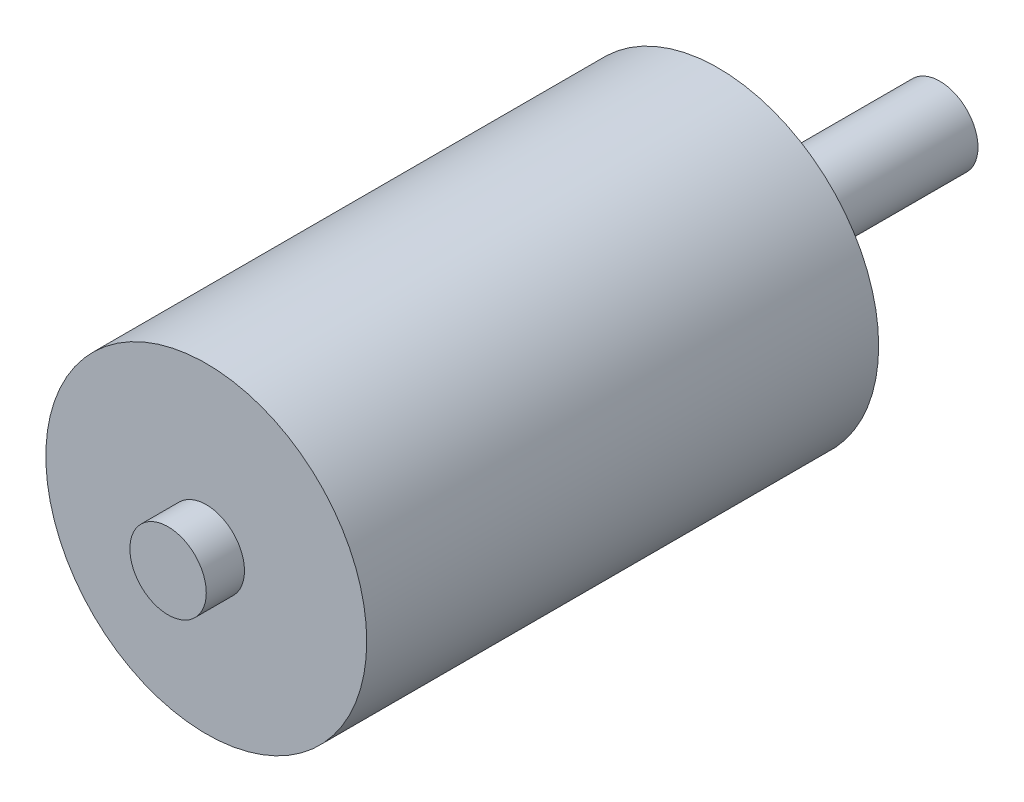
ISO-10303-21;
HEADER;
FILE_DESCRIPTION(('STEP AP214'),'2;1');
FILE_NAME('part.step','',(''),(''),'','','');
FILE_SCHEMA(('AUTOMOTIVE_DESIGN { 1 0 10303 214 1 1 1 1 }'));
ENDSEC;
DATA;
#1=APPLICATION_CONTEXT('core data for automotive mechanical design processes');
#2=APPLICATION_PROTOCOL_DEFINITION('international standard','automotive_design',2000,#1);
#3=PRODUCT_CONTEXT('',#1,'mechanical');
#4=PRODUCT('Part','Part','',(#3));
#5=PRODUCT_RELATED_PRODUCT_CATEGORY('part','',(#4));
#6=PRODUCT_DEFINITION_FORMATION('','',#4);
#7=PRODUCT_DEFINITION_CONTEXT('part definition',#1,'design');
#8=PRODUCT_DEFINITION('design','',#6,#7);
#9=PRODUCT_DEFINITION_SHAPE('','',#8);
#10=(LENGTH_UNIT() NAMED_UNIT(*) SI_UNIT(.MILLI.,.METRE.));
#11=(NAMED_UNIT(*) PLANE_ANGLE_UNIT() SI_UNIT($,.RADIAN.));
#12=(NAMED_UNIT(*) SI_UNIT($,.STERADIAN.) SOLID_ANGLE_UNIT());
#13=UNCERTAINTY_MEASURE_WITH_UNIT(LENGTH_MEASURE(1.E-05),#10,'distance_accuracy_value','');
#14=(GEOMETRIC_REPRESENTATION_CONTEXT(3) GLOBAL_UNCERTAINTY_ASSIGNED_CONTEXT((#13)) GLOBAL_UNIT_ASSIGNED_CONTEXT((#10,
#11,#12)) REPRESENTATION_CONTEXT('',''));
#15=CARTESIAN_POINT('',(0.,0.,0.));
#16=DIRECTION('',(0.,0.,1.));
#17=DIRECTION('',(1.,0.,0.));
#18=AXIS2_PLACEMENT_3D('',#15,#16,#17);
#19=CARTESIAN_POINT('',(0.,0.,67.));
#20=DIRECTION('',(0.,0.,-1.));
#21=DIRECTION('',(-1.,0.,0.));
#22=AXIS2_PLACEMENT_3D('',#19,#20,#21);
#23=CYLINDRICAL_SURFACE('',#22,21.);
#24=CARTESIAN_POINT('',(0.,0.,67.));
#25=DIRECTION('',(0.,0.,1.));
#26=DIRECTION('',(1.,0.,0.));
#27=AXIS2_PLACEMENT_3D('',#24,#25,#26);
#28=CIRCLE('',#27,21.);
#29=CARTESIAN_POINT('',(21.,0.,67.));
#30=VERTEX_POINT('',#29);
#31=EDGE_CURVE('E10',#30,#30,#28,.T.);
#32=ORIENTED_EDGE('',*,*,#31,.F.);
#33=EDGE_LOOP('',(#32));
#34=FACE_BOUND('',#33,.T.);
#35=CARTESIAN_POINT('',(0.,0.,0.));
#36=DIRECTION('',(0.,0.,1.));
#37=DIRECTION('',(1.,0.,0.));
#38=AXIS2_PLACEMENT_3D('',#35,#36,#37);
#39=CIRCLE('',#38,21.);
#40=CARTESIAN_POINT('',(21.,0.,0.));
#41=VERTEX_POINT('',#40);
#42=EDGE_CURVE('E42',#41,#41,#39,.T.);
#43=ORIENTED_EDGE('',*,*,#42,.T.);
#44=EDGE_LOOP('',(#43));
#45=FACE_BOUND('',#44,.T.);
#46=ADVANCED_FACE('F35',(#34,#45),#23,.T.);
#47=CARTESIAN_POINT('',(0.,0.,67.));
#48=DIRECTION('',(0.,0.,1.));
#49=DIRECTION('',(1.,0.,0.));
#50=AXIS2_PLACEMENT_3D('',#47,#48,#49);
#51=PLANE('',#50);
#52=CARTESIAN_POINT('',(0.,0.,67.));
#53=DIRECTION('',(0.,0.,1.));
#54=DIRECTION('',(1.,0.,0.));
#55=AXIS2_PLACEMENT_3D('',#52,#53,#54);
#56=CIRCLE('',#55,5.);
#57=CARTESIAN_POINT('',(5.,0.,67.));
#58=VERTEX_POINT('',#57);
#59=EDGE_CURVE('E58',#58,#58,#56,.T.);
#60=ORIENTED_EDGE('',*,*,#59,.F.);
#61=EDGE_LOOP('',(#60));
#62=FACE_BOUND('',#61,.T.);
#63=ORIENTED_EDGE('',*,*,#31,.T.);
#64=EDGE_LOOP('',(#63));
#65=FACE_BOUND('',#64,.T.);
#66=ADVANCED_FACE('F100',(#62,#65),#51,.T.);
#67=CARTESIAN_POINT('',(0.,0.,0.));
#68=DIRECTION('',(0.,0.,1.));
#69=DIRECTION('',(1.,0.,0.));
#70=AXIS2_PLACEMENT_3D('',#67,#68,#69);
#71=PLANE('',#70);
#72=CARTESIAN_POINT('',(17.5,0.,0.));
#73=DIRECTION('',(0.,0.,1.));
#74=DIRECTION('',(1.,0.,0.));
#75=AXIS2_PLACEMENT_3D('',#72,#73,#74);
#76=CIRCLE('',#75,2.);
#77=CARTESIAN_POINT('',(19.5,0.,0.));
#78=VERTEX_POINT('',#77);
#79=EDGE_CURVE('E82',#78,#78,#76,.T.);
#80=ORIENTED_EDGE('',*,*,#79,.T.);
#81=EDGE_LOOP('',(#80));
#82=FACE_BOUND('',#81,.T.);
#83=CARTESIAN_POINT('',(0.,17.5,0.));
#84=DIRECTION('',(0.,0.,1.));
#85=DIRECTION('',(1.,0.,0.));
#86=AXIS2_PLACEMENT_3D('',#83,#84,#85);
#87=CIRCLE('',#86,2.);
#88=CARTESIAN_POINT('',(2.,17.5,0.));
#89=VERTEX_POINT('',#88);
#90=EDGE_CURVE('E76',#89,#89,#87,.T.);
#91=ORIENTED_EDGE('',*,*,#90,.T.);
#92=EDGE_LOOP('',(#91));
#93=FACE_BOUND('',#92,.T.);
#94=CARTESIAN_POINT('',(0.,-17.5,0.));
#95=DIRECTION('',(0.,0.,1.));
#96=DIRECTION('',(1.,0.,0.));
#97=AXIS2_PLACEMENT_3D('',#94,#95,#96);
#98=CIRCLE('',#97,2.);
#99=CARTESIAN_POINT('',(2.,-17.5,0.));
#100=VERTEX_POINT('',#99);
#101=EDGE_CURVE('E70',#100,#100,#98,.T.);
#102=ORIENTED_EDGE('',*,*,#101,.T.);
#103=EDGE_LOOP('',(#102));
#104=FACE_BOUND('',#103,.T.);
#105=CARTESIAN_POINT('',(-17.5,0.,0.));
#106=DIRECTION('',(0.,0.,1.));
#107=DIRECTION('',(1.,0.,0.));
#108=AXIS2_PLACEMENT_3D('',#105,#106,#107);
#109=CIRCLE('',#108,2.);
#110=CARTESIAN_POINT('',(-15.5,0.,0.));
#111=VERTEX_POINT('',#110);
#112=EDGE_CURVE('E64',#111,#111,#109,.T.);
#113=ORIENTED_EDGE('',*,*,#112,.T.);
#114=EDGE_LOOP('',(#113));
#115=FACE_BOUND('',#114,.T.);
#116=CARTESIAN_POINT('',(0.,0.,0.));
#117=DIRECTION('',(0.,0.,1.));
#118=DIRECTION('',(1.,0.,0.));
#119=AXIS2_PLACEMENT_3D('',#116,#117,#118);
#120=CIRCLE('',#119,13.);
#121=CARTESIAN_POINT('',(13.,0.,0.));
#122=VERTEX_POINT('',#121);
#123=EDGE_CURVE('E49',#122,#122,#120,.T.);
#124=ORIENTED_EDGE('',*,*,#123,.T.);
#125=EDGE_LOOP('',(#124));
#126=FACE_BOUND('',#125,.T.);
#127=ORIENTED_EDGE('',*,*,#42,.F.);
#128=EDGE_LOOP('',(#127));
#129=FACE_BOUND('',#128,.T.);
#130=ADVANCED_FACE('F105',(#82,#93,#104,#115,#126,#129),#71,.F.);
#131=CARTESIAN_POINT('',(0.,0.,-2.));
#132=DIRECTION('',(0.,0.,1.));
#133=DIRECTION('',(1.,0.,0.));
#134=AXIS2_PLACEMENT_3D('',#131,#132,#133);
#135=CYLINDRICAL_SURFACE('',#134,13.);
#136=CARTESIAN_POINT('',(0.,0.,-2.));
#137=DIRECTION('',(0.,0.,1.));
#138=DIRECTION('',(1.,0.,0.));
#139=AXIS2_PLACEMENT_3D('',#136,#137,#138);
#140=CIRCLE('',#139,13.);
#141=CARTESIAN_POINT('',(13.,0.,-2.));
#142=VERTEX_POINT('',#141);
#143=EDGE_CURVE('E47',#142,#142,#140,.T.);
#144=ORIENTED_EDGE('',*,*,#143,.T.);
#145=EDGE_LOOP('',(#144));
#146=FACE_BOUND('',#145,.T.);
#147=ORIENTED_EDGE('',*,*,#123,.F.);
#148=EDGE_LOOP('',(#147));
#149=FACE_BOUND('',#148,.T.);
#150=ADVANCED_FACE('F112',(#146,#149),#135,.T.);
#151=CARTESIAN_POINT('',(0.,0.,-2.));
#152=DIRECTION('',(0.,0.,1.));
#153=DIRECTION('',(1.,0.,0.));
#154=AXIS2_PLACEMENT_3D('',#151,#152,#153);
#155=PLANE('',#154);
#156=CARTESIAN_POINT('',(0.,0.,-2.));
#157=DIRECTION('',(0.,0.,1.));
#158=DIRECTION('',(1.,0.,0.));
#159=AXIS2_PLACEMENT_3D('',#156,#157,#158);
#160=CIRCLE('',#159,5.);
#161=CARTESIAN_POINT('',(5.,0.,-2.));
#162=VERTEX_POINT('',#161);
#163=EDGE_CURVE('E38',#162,#162,#160,.T.);
#164=ORIENTED_EDGE('',*,*,#163,.T.);
#165=EDGE_LOOP('',(#164));
#166=FACE_BOUND('',#165,.T.);
#167=ORIENTED_EDGE('',*,*,#143,.F.);
#168=EDGE_LOOP('',(#167));
#169=FACE_BOUND('',#168,.T.);
#170=ADVANCED_FACE('F117',(#166,#169),#155,.F.);
#171=CARTESIAN_POINT('',(0.,0.,-29.));
#172=DIRECTION('',(0.,0.,1.));
#173=DIRECTION('',(1.,0.,0.));
#174=AXIS2_PLACEMENT_3D('',#171,#172,#173);
#175=CYLINDRICAL_SURFACE('',#174,5.);
#176=CARTESIAN_POINT('',(0.,0.,-29.));
#177=DIRECTION('',(0.,0.,1.));
#178=DIRECTION('',(1.,0.,0.));
#179=AXIS2_PLACEMENT_3D('',#176,#177,#178);
#180=CIRCLE('',#179,5.);
#181=CARTESIAN_POINT('',(5.,0.,-29.));
#182=VERTEX_POINT('',#181);
#183=EDGE_CURVE('E54',#182,#182,#180,.T.);
#184=CARTESIAN_POINT('',(5.,0.,-29.));
#185=CARTESIAN_POINT('',(5.,0.,-28.71875));
#186=CARTESIAN_POINT('',(5.,0.,-28.4375));
#187=CARTESIAN_POINT('',(5.,0.,-27.875));
#188=CARTESIAN_POINT('',(5.,0.,-27.59375));
#189=CARTESIAN_POINT('',(5.,0.,-27.03125));
#190=CARTESIAN_POINT('',(5.,0.,-26.75));
#191=CARTESIAN_POINT('',(5.,0.,-26.1875));
#192=CARTESIAN_POINT('',(5.,0.,-25.90625));
#193=CARTESIAN_POINT('',(5.,0.,-25.34375));
#194=CARTESIAN_POINT('',(5.,0.,-25.0625));
#195=CARTESIAN_POINT('',(5.,0.,-24.5));
#196=CARTESIAN_POINT('',(5.,0.,-24.21875));
#197=CARTESIAN_POINT('',(5.,0.,-23.65625));
#198=CARTESIAN_POINT('',(5.,0.,-23.375));
#199=CARTESIAN_POINT('',(5.,0.,-22.8125));
#200=CARTESIAN_POINT('',(5.,0.,-22.53125));
#201=CARTESIAN_POINT('',(5.,0.,-21.96875));
#202=CARTESIAN_POINT('',(5.,0.,-21.6875));
#203=CARTESIAN_POINT('',(5.,0.,-21.125));
#204=CARTESIAN_POINT('',(5.,0.,-20.84375));
#205=CARTESIAN_POINT('',(5.,0.,-20.28125));
#206=CARTESIAN_POINT('',(5.,0.,-20.));
#207=CARTESIAN_POINT('',(5.,0.,-19.4375));
#208=CARTESIAN_POINT('',(5.,0.,-19.15625));
#209=CARTESIAN_POINT('',(5.,0.,-18.59375));
#210=CARTESIAN_POINT('',(5.,0.,-18.3125));
#211=CARTESIAN_POINT('',(5.,0.,-17.75));
#212=CARTESIAN_POINT('',(5.,0.,-17.46875));
#213=CARTESIAN_POINT('',(5.,0.,-16.90625));
#214=CARTESIAN_POINT('',(5.,0.,-16.625));
#215=CARTESIAN_POINT('',(5.,0.,-16.0625));
#216=CARTESIAN_POINT('',(5.,0.,-15.78125));
#217=CARTESIAN_POINT('',(5.,0.,-15.21875));
#218=CARTESIAN_POINT('',(5.,0.,-14.9375));
#219=CARTESIAN_POINT('',(5.,0.,-14.375));
#220=CARTESIAN_POINT('',(5.,0.,-14.09375));
#221=CARTESIAN_POINT('',(5.,0.,-13.53125));
#222=CARTESIAN_POINT('',(5.,0.,-13.25));
#223=CARTESIAN_POINT('',(5.,0.,-12.6875));
#224=CARTESIAN_POINT('',(5.,0.,-12.40625));
#225=CARTESIAN_POINT('',(5.,0.,-11.84375));
#226=CARTESIAN_POINT('',(5.,0.,-11.5625));
#227=CARTESIAN_POINT('',(5.,0.,-11.));
#228=CARTESIAN_POINT('',(5.,0.,-10.71875));
#229=CARTESIAN_POINT('',(5.,0.,-10.15625));
#230=CARTESIAN_POINT('',(5.,0.,-9.875));
#231=CARTESIAN_POINT('',(5.,0.,-9.3125));
#232=CARTESIAN_POINT('',(5.,0.,-9.03125));
#233=CARTESIAN_POINT('',(5.,0.,-8.46875));
#234=CARTESIAN_POINT('',(5.,0.,-8.1875));
#235=CARTESIAN_POINT('',(5.,0.,-7.625));
#236=CARTESIAN_POINT('',(5.,0.,-7.34375));
#237=CARTESIAN_POINT('',(5.,0.,-6.78125));
#238=CARTESIAN_POINT('',(5.,0.,-6.5));
#239=CARTESIAN_POINT('',(5.,0.,-5.9375));
#240=CARTESIAN_POINT('',(5.,0.,-5.65625));
#241=CARTESIAN_POINT('',(5.,0.,-5.09375));
#242=CARTESIAN_POINT('',(5.,0.,-4.8125));
#243=CARTESIAN_POINT('',(5.,0.,-4.25));
#244=CARTESIAN_POINT('',(5.,0.,-3.96875));
#245=CARTESIAN_POINT('',(5.,0.,-3.40625));
#246=CARTESIAN_POINT('',(5.,0.,-3.125));
#247=CARTESIAN_POINT('',(5.,0.,-2.5625));
#248=CARTESIAN_POINT('',(5.,0.,-2.28125));
#249=CARTESIAN_POINT('',(5.,0.,-2.));
#250=B_SPLINE_CURVE_WITH_KNOTS('',3,(#184,#185,#186,#187,#188,#189,#190,#191,#192,#193,#194,
#195,#196,#197,#198,#199,#200,#201,#202,#203,#204,#205,#206,#207,#208,#209,#210,#211,#212,#213,
#214,#215,#216,#217,#218,#219,#220,#221,#222,#223,#224,#225,#226,#227,#228,#229,#230,#231,#232,
#233,#234,#235,#236,#237,#238,#239,#240,#241,#242,#243,#244,#245,#246,#247,#248,#249),
.UNSPECIFIED.,.F.,.F.,(4,2,2,2,2,2,2,2,2,2,2,2,2,2,2,2,2,2,2,2,2,2,2,2,2,2,2,2,2,2,2,2,4),(0.,
0.843749999999997,1.6875,2.53125,3.375,4.21875,5.0625,5.90625,6.75,7.59375,8.4375,9.28125,
10.125,10.96875,11.8125,12.65625,13.5,14.34375,15.1875,16.03125,16.875,17.71875,18.5625,
19.40625,20.25,21.09375,21.9375,22.78125,23.625,24.46875,25.3125,26.15625,27.),.UNSPECIFIED.);
#251=EDGE_CURVE('BSEAM124',#182,#162,#250,.T.);
#252=ORIENTED_EDGE('',*,*,#183,.T.);
#253=ORIENTED_EDGE('',*,*,#163,.F.);
#254=ORIENTED_EDGE('',*,*,#251,.T.);
#255=ORIENTED_EDGE('',*,*,#251,.F.);
#256=EDGE_LOOP('',(#252,#254,#253,#255));
#257=FACE_BOUND('',#256,.T.);
#258=ADVANCED_FACE('F124',(#257),#175,.T.);
#259=CARTESIAN_POINT('',(0.,0.,-29.));
#260=DIRECTION('',(0.,0.,1.));
#261=DIRECTION('',(1.,0.,0.));
#262=AXIS2_PLACEMENT_3D('',#259,#260,#261);
#263=PLANE('',#262);
#264=ORIENTED_EDGE('',*,*,#183,.F.);
#265=EDGE_LOOP('',(#264));
#266=FACE_BOUND('',#265,.T.);
#267=ADVANCED_FACE('F128',(#266),#263,.F.);
#268=CARTESIAN_POINT('',(0.,0.,72.));
#269=DIRECTION('',(0.,0.,-1.));
#270=DIRECTION('',(-1.,0.,0.));
#271=AXIS2_PLACEMENT_3D('',#268,#269,#270);
#272=CYLINDRICAL_SURFACE('',#271,5.);
#273=CARTESIAN_POINT('',(0.,0.,72.));
#274=DIRECTION('',(0.,0.,1.));
#275=DIRECTION('',(1.,0.,0.));
#276=AXIS2_PLACEMENT_3D('',#273,#274,#275);
#277=CIRCLE('',#276,5.);
#278=CARTESIAN_POINT('',(5.,0.,72.));
#279=VERTEX_POINT('',#278);
#280=EDGE_CURVE('E57',#279,#279,#277,.T.);
#281=ORIENTED_EDGE('',*,*,#280,.F.);
#282=EDGE_LOOP('',(#281));
#283=FACE_BOUND('',#282,.T.);
#284=ORIENTED_EDGE('',*,*,#59,.T.);
#285=EDGE_LOOP('',(#284));
#286=FACE_BOUND('',#285,.T.);
#287=ADVANCED_FACE('F132',(#283,#286),#272,.T.);
#288=CARTESIAN_POINT('',(0.,0.,72.));
#289=DIRECTION('',(0.,0.,1.));
#290=DIRECTION('',(1.,0.,0.));
#291=AXIS2_PLACEMENT_3D('',#288,#289,#290);
#292=PLANE('',#291);
#293=ORIENTED_EDGE('',*,*,#280,.T.);
#294=EDGE_LOOP('',(#293));
#295=FACE_BOUND('',#294,.T.);
#296=ADVANCED_FACE('F136',(#295),#292,.T.);
#297=CARTESIAN_POINT('',(-17.5,0.,7.));
#298=DIRECTION('',(0.,0.,-1.));
#299=DIRECTION('',(-1.,0.,0.));
#300=AXIS2_PLACEMENT_3D('',#297,#298,#299);
#301=CYLINDRICAL_SURFACE('',#300,2.);
#302=CARTESIAN_POINT('',(-17.5,0.,7.));
#303=DIRECTION('',(0.,0.,1.));
#304=DIRECTION('',(1.,0.,0.));
#305=AXIS2_PLACEMENT_3D('',#302,#303,#304);
#306=CIRCLE('',#305,2.);
#307=CARTESIAN_POINT('',(-15.5,0.,7.));
#308=VERTEX_POINT('',#307);
#309=EDGE_CURVE('E61',#308,#308,#306,.T.);
#310=ORIENTED_EDGE('',*,*,#309,.T.);
#311=EDGE_LOOP('',(#310));
#312=FACE_BOUND('',#311,.T.);
#313=ORIENTED_EDGE('',*,*,#112,.F.);
#314=EDGE_LOOP('',(#313));
#315=FACE_BOUND('',#314,.T.);
#316=ADVANCED_FACE('F140',(#312,#315),#301,.F.);
#317=CARTESIAN_POINT('',(-17.5,0.,7.));
#318=DIRECTION('',(0.,0.,1.));
#319=DIRECTION('',(1.,0.,0.));
#320=AXIS2_PLACEMENT_3D('',#317,#318,#319);
#321=PLANE('',#320);
#322=ORIENTED_EDGE('',*,*,#309,.F.);
#323=EDGE_LOOP('',(#322));
#324=FACE_BOUND('',#323,.T.);
#325=ADVANCED_FACE('F144',(#324),#321,.F.);
#326=CARTESIAN_POINT('',(0.,-17.5,7.));
#327=DIRECTION('',(0.,0.,-1.));
#328=DIRECTION('',(-1.,0.,0.));
#329=AXIS2_PLACEMENT_3D('',#326,#327,#328);
#330=CYLINDRICAL_SURFACE('',#329,2.);
#331=CARTESIAN_POINT('',(0.,-17.5,7.));
#332=DIRECTION('',(0.,0.,1.));
#333=DIRECTION('',(1.,0.,0.));
#334=AXIS2_PLACEMENT_3D('',#331,#332,#333);
#335=CIRCLE('',#334,2.);
#336=CARTESIAN_POINT('',(2.,-17.5,7.));
#337=VERTEX_POINT('',#336);
#338=EDGE_CURVE('E73',#337,#337,#335,.T.);
#339=ORIENTED_EDGE('',*,*,#338,.T.);
#340=EDGE_LOOP('',(#339));
#341=FACE_BOUND('',#340,.T.);
#342=ORIENTED_EDGE('',*,*,#101,.F.);
#343=EDGE_LOOP('',(#342));
#344=FACE_BOUND('',#343,.T.);
#345=ADVANCED_FACE('F148',(#341,#344),#330,.F.);
#346=CARTESIAN_POINT('',(0.,-17.5,7.));
#347=DIRECTION('',(0.,0.,1.));
#348=DIRECTION('',(1.,0.,0.));
#349=AXIS2_PLACEMENT_3D('',#346,#347,#348);
#350=PLANE('',#349);
#351=ORIENTED_EDGE('',*,*,#338,.F.);
#352=EDGE_LOOP('',(#351));
#353=FACE_BOUND('',#352,.T.);
#354=ADVANCED_FACE('F152',(#353),#350,.F.);
#355=CARTESIAN_POINT('',(0.,17.5,7.));
#356=DIRECTION('',(0.,0.,-1.));
#357=DIRECTION('',(-1.,0.,0.));
#358=AXIS2_PLACEMENT_3D('',#355,#356,#357);
#359=CYLINDRICAL_SURFACE('',#358,2.);
#360=CARTESIAN_POINT('',(0.,17.5,7.));
#361=DIRECTION('',(0.,0.,1.));
#362=DIRECTION('',(1.,0.,0.));
#363=AXIS2_PLACEMENT_3D('',#360,#361,#362);
#364=CIRCLE('',#363,2.);
#365=CARTESIAN_POINT('',(2.,17.5,7.));
#366=VERTEX_POINT('',#365);
#367=EDGE_CURVE('E79',#366,#366,#364,.T.);
#368=ORIENTED_EDGE('',*,*,#367,.T.);
#369=EDGE_LOOP('',(#368));
#370=FACE_BOUND('',#369,.T.);
#371=ORIENTED_EDGE('',*,*,#90,.F.);
#372=EDGE_LOOP('',(#371));
#373=FACE_BOUND('',#372,.T.);
#374=ADVANCED_FACE('F156',(#370,#373),#359,.F.);
#375=CARTESIAN_POINT('',(0.,17.5,7.));
#376=DIRECTION('',(0.,0.,1.));
#377=DIRECTION('',(1.,0.,0.));
#378=AXIS2_PLACEMENT_3D('',#375,#376,#377);
#379=PLANE('',#378);
#380=ORIENTED_EDGE('',*,*,#367,.F.);
#381=EDGE_LOOP('',(#380));
#382=FACE_BOUND('',#381,.T.);
#383=ADVANCED_FACE('F97',(#382),#379,.F.);
#384=CARTESIAN_POINT('',(17.5,0.,7.));
#385=DIRECTION('',(0.,0.,-1.));
#386=DIRECTION('',(-1.,0.,0.));
#387=AXIS2_PLACEMENT_3D('',#384,#385,#386);
#388=CYLINDRICAL_SURFACE('',#387,2.);
#389=CARTESIAN_POINT('',(17.5,0.,7.));
#390=DIRECTION('',(0.,0.,1.));
#391=DIRECTION('',(1.,0.,0.));
#392=AXIS2_PLACEMENT_3D('',#389,#390,#391);
#393=CIRCLE('',#392,2.);
#394=CARTESIAN_POINT('',(19.5,0.,7.));
#395=VERTEX_POINT('',#394);
#396=EDGE_CURVE('E67',#395,#395,#393,.T.);
#397=ORIENTED_EDGE('',*,*,#396,.T.);
#398=EDGE_LOOP('',(#397));
#399=FACE_BOUND('',#398,.T.);
#400=ORIENTED_EDGE('',*,*,#79,.F.);
#401=EDGE_LOOP('',(#400));
#402=FACE_BOUND('',#401,.T.);
#403=ADVANCED_FACE('F88',(#399,#402),#388,.F.);
#404=CARTESIAN_POINT('',(17.5,0.,7.));
#405=DIRECTION('',(0.,0.,1.));
#406=DIRECTION('',(1.,0.,0.));
#407=AXIS2_PLACEMENT_3D('',#404,#405,#406);
#408=PLANE('',#407);
#409=ORIENTED_EDGE('',*,*,#396,.F.);
#410=EDGE_LOOP('',(#409));
#411=FACE_BOUND('',#410,.T.);
#412=ADVANCED_FACE('F91',(#411),#408,.F.);
#413=CLOSED_SHELL('',(#46,#66,#130,#150,#170,#258,#267,#287,#296,#316,#325,#345,#354,#374,#383,
#403,#412));
#414=MANIFOLD_SOLID_BREP('B2',#413);
#415=ADVANCED_BREP_SHAPE_REPRESENTATION('',(#18,#414),#14);
#416=SHAPE_DEFINITION_REPRESENTATION(#9,#415);
ENDSEC;
END-ISO-10303-21;
